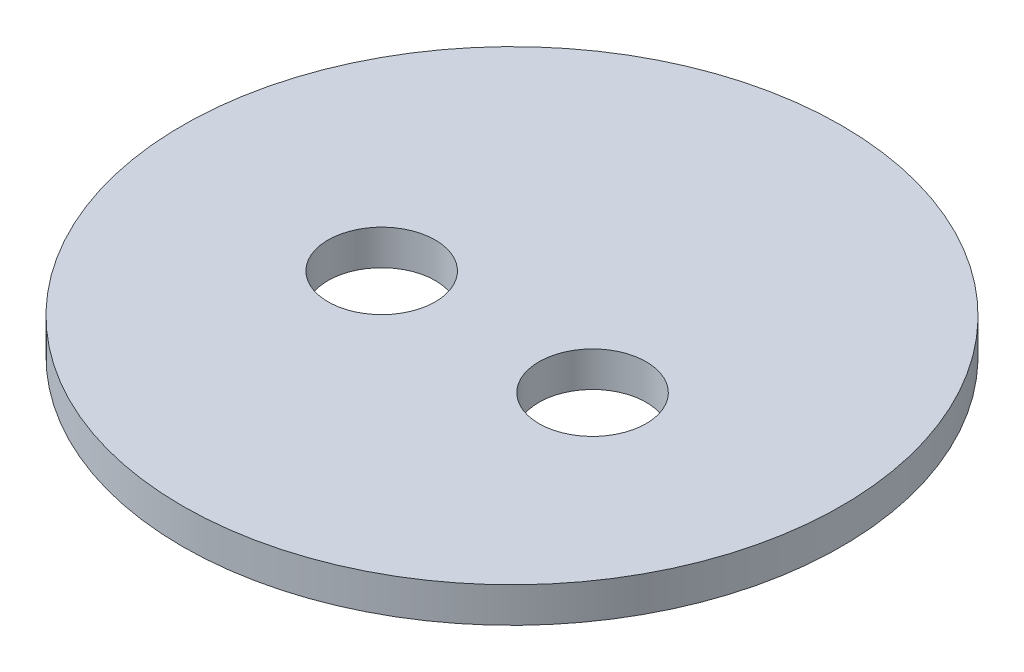
ISO-10303-21;
HEADER;
FILE_DESCRIPTION(('STEP AP214'),'2;1');
FILE_NAME('part.step','',(''),(''),'','','');
FILE_SCHEMA(('AUTOMOTIVE_DESIGN { 1 0 10303 214 1 1 1 1 }'));
ENDSEC;
DATA;
#1=APPLICATION_CONTEXT('core data for automotive mechanical design processes');
#2=APPLICATION_PROTOCOL_DEFINITION('international standard','automotive_design',2000,#1);
#3=PRODUCT_CONTEXT('',#1,'mechanical');
#4=PRODUCT('Part','Part','',(#3));
#5=PRODUCT_RELATED_PRODUCT_CATEGORY('part','',(#4));
#6=PRODUCT_DEFINITION_FORMATION('','',#4);
#7=PRODUCT_DEFINITION_CONTEXT('part definition',#1,'design');
#8=PRODUCT_DEFINITION('design','',#6,#7);
#9=PRODUCT_DEFINITION_SHAPE('','',#8);
#10=(LENGTH_UNIT() NAMED_UNIT(*) SI_UNIT(.MILLI.,.METRE.));
#11=(NAMED_UNIT(*) PLANE_ANGLE_UNIT() SI_UNIT($,.RADIAN.));
#12=(NAMED_UNIT(*) SI_UNIT($,.STERADIAN.) SOLID_ANGLE_UNIT());
#13=UNCERTAINTY_MEASURE_WITH_UNIT(LENGTH_MEASURE(1.E-05),#10,'distance_accuracy_value','');
#14=(GEOMETRIC_REPRESENTATION_CONTEXT(3) GLOBAL_UNCERTAINTY_ASSIGNED_CONTEXT((#13)) GLOBAL_UNIT_ASSIGNED_CONTEXT((#10,
#11,#12)) REPRESENTATION_CONTEXT('',''));
#15=CARTESIAN_POINT('',(0.,0.,0.));
#16=DIRECTION('',(0.,0.,1.));
#17=DIRECTION('',(1.,0.,0.));
#18=AXIS2_PLACEMENT_3D('',#15,#16,#17);
#19=CARTESIAN_POINT('',(0.,1.,0.));
#20=DIRECTION('',(0.,-1.,0.));
#21=DIRECTION('',(0.,0.,-1.));
#22=AXIS2_PLACEMENT_3D('',#19,#20,#21);
#23=CYLINDRICAL_SURFACE('',#22,9.375);
#24=CARTESIAN_POINT('',(0.,1.,0.));
#25=DIRECTION('',(0.,1.,0.));
#26=DIRECTION('',(0.,0.,1.));
#27=AXIS2_PLACEMENT_3D('',#24,#25,#26);
#28=CIRCLE('',#27,9.375);
#29=CARTESIAN_POINT('',(0.,1.,9.375));
#30=VERTEX_POINT('',#29);
#31=EDGE_CURVE('E10',#30,#30,#28,.T.);
#32=ORIENTED_EDGE('',*,*,#31,.F.);
#33=EDGE_LOOP('',(#32));
#34=FACE_BOUND('',#33,.T.);
#35=CARTESIAN_POINT('',(0.,0.,0.));
#36=DIRECTION('',(0.,1.,0.));
#37=DIRECTION('',(0.,0.,1.));
#38=AXIS2_PLACEMENT_3D('',#35,#36,#37);
#39=CIRCLE('',#38,9.375);
#40=CARTESIAN_POINT('',(0.,0.,9.375));
#41=VERTEX_POINT('',#40);
#42=EDGE_CURVE('E39',#41,#41,#39,.T.);
#43=ORIENTED_EDGE('',*,*,#42,.T.);
#44=EDGE_LOOP('',(#43));
#45=FACE_BOUND('',#44,.T.);
#46=ADVANCED_FACE('F36',(#34,#45),#23,.T.);
#47=CARTESIAN_POINT('',(0.,1.,0.));
#48=DIRECTION('',(0.,1.,0.));
#49=DIRECTION('',(0.,0.,1.));
#50=AXIS2_PLACEMENT_3D('',#47,#48,#49);
#51=PLANE('',#50);
#52=CARTESIAN_POINT('',(3.04208057773126,1.,0.75));
#53=DIRECTION('',(0.,1.,0.));
#54=DIRECTION('',(0.,0.,1.));
#55=AXIS2_PLACEMENT_3D('',#52,#53,#54);
#56=CIRCLE('',#55,1.525);
#57=CARTESIAN_POINT('',(3.04208057773126,1.,2.275));
#58=VERTEX_POINT('',#57);
#59=EDGE_CURVE('E54',#58,#58,#56,.T.);
#60=ORIENTED_EDGE('',*,*,#59,.F.);
#61=EDGE_LOOP('',(#60));
#62=FACE_BOUND('',#61,.T.);
#63=CARTESIAN_POINT('',(-2.95791942226874,1.,0.75));
#64=DIRECTION('',(0.,1.,0.));
#65=DIRECTION('',(0.,0.,-1.));
#66=AXIS2_PLACEMENT_3D('',#63,#64,#65);
#67=CIRCLE('',#66,1.525);
#68=CARTESIAN_POINT('',(-2.95791942226874,1.,-0.775000000000001));
#69=VERTEX_POINT('',#68);
#70=EDGE_CURVE('E48',#69,#69,#67,.T.);
#71=ORIENTED_EDGE('',*,*,#70,.F.);
#72=EDGE_LOOP('',(#71));
#73=FACE_BOUND('',#72,.T.);
#74=ORIENTED_EDGE('',*,*,#31,.T.);
#75=EDGE_LOOP('',(#74));
#76=FACE_BOUND('',#75,.T.);
#77=ADVANCED_FACE('F70',(#62,#73,#76),#51,.T.);
#78=CARTESIAN_POINT('',(0.,0.,0.));
#79=DIRECTION('',(0.,1.,0.));
#80=DIRECTION('',(0.,0.,1.));
#81=AXIS2_PLACEMENT_3D('',#78,#79,#80);
#82=PLANE('',#81);
#83=CARTESIAN_POINT('',(3.04208057773126,0.,0.75));
#84=DIRECTION('',(0.,1.,0.));
#85=DIRECTION('',(0.,0.,1.));
#86=AXIS2_PLACEMENT_3D('',#83,#84,#85);
#87=CIRCLE('',#86,1.525);
#88=CARTESIAN_POINT('',(3.04208057773126,0.,2.275));
#89=VERTEX_POINT('',#88);
#90=EDGE_CURVE('E46',#89,#89,#87,.T.);
#91=ORIENTED_EDGE('',*,*,#90,.T.);
#92=EDGE_LOOP('',(#91));
#93=FACE_BOUND('',#92,.T.);
#94=CARTESIAN_POINT('',(-2.95791942226874,0.,0.75));
#95=DIRECTION('',(0.,1.,0.));
#96=DIRECTION('',(0.,0.,-1.));
#97=AXIS2_PLACEMENT_3D('',#94,#95,#96);
#98=CIRCLE('',#97,1.525);
#99=CARTESIAN_POINT('',(-2.95791942226874,0.,-0.775000000000001));
#100=VERTEX_POINT('',#99);
#101=EDGE_CURVE('E51',#100,#100,#98,.T.);
#102=ORIENTED_EDGE('',*,*,#101,.T.);
#103=EDGE_LOOP('',(#102));
#104=FACE_BOUND('',#103,.T.);
#105=ORIENTED_EDGE('',*,*,#42,.F.);
#106=EDGE_LOOP('',(#105));
#107=FACE_BOUND('',#106,.T.);
#108=ADVANCED_FACE('F60',(#93,#104,#107),#82,.F.);
#109=CARTESIAN_POINT('',(-2.95791942226874,0.,0.75));
#110=DIRECTION('',(0.,1.,0.));
#111=DIRECTION('',(0.,0.,1.));
#112=AXIS2_PLACEMENT_3D('',#109,#110,#111);
#113=CYLINDRICAL_SURFACE('',#112,1.525);
#114=ORIENTED_EDGE('',*,*,#101,.F.);
#115=EDGE_LOOP('',(#114));
#116=FACE_BOUND('',#115,.T.);
#117=ORIENTED_EDGE('',*,*,#70,.T.);
#118=EDGE_LOOP('',(#117));
#119=FACE_BOUND('',#118,.T.);
#120=ADVANCED_FACE('F66',(#116,#119),#113,.F.);
#121=CARTESIAN_POINT('',(3.04208057773126,0.,0.75));
#122=DIRECTION('',(0.,1.,0.));
#123=DIRECTION('',(0.,0.,1.));
#124=AXIS2_PLACEMENT_3D('',#121,#122,#123);
#125=CYLINDRICAL_SURFACE('',#124,1.525);
#126=ORIENTED_EDGE('',*,*,#90,.F.);
#127=EDGE_LOOP('',(#126));
#128=FACE_BOUND('',#127,.T.);
#129=ORIENTED_EDGE('',*,*,#59,.T.);
#130=EDGE_LOOP('',(#129));
#131=FACE_BOUND('',#130,.T.);
#132=ADVANCED_FACE('F63',(#128,#131),#125,.F.);
#133=CLOSED_SHELL('',(#46,#77,#108,#120,#132));
#134=MANIFOLD_SOLID_BREP('B2',#133);
#135=ADVANCED_BREP_SHAPE_REPRESENTATION('',(#18,#134),#14);
#136=SHAPE_DEFINITION_REPRESENTATION(#9,#135);
ENDSEC;
END-ISO-10303-21;
